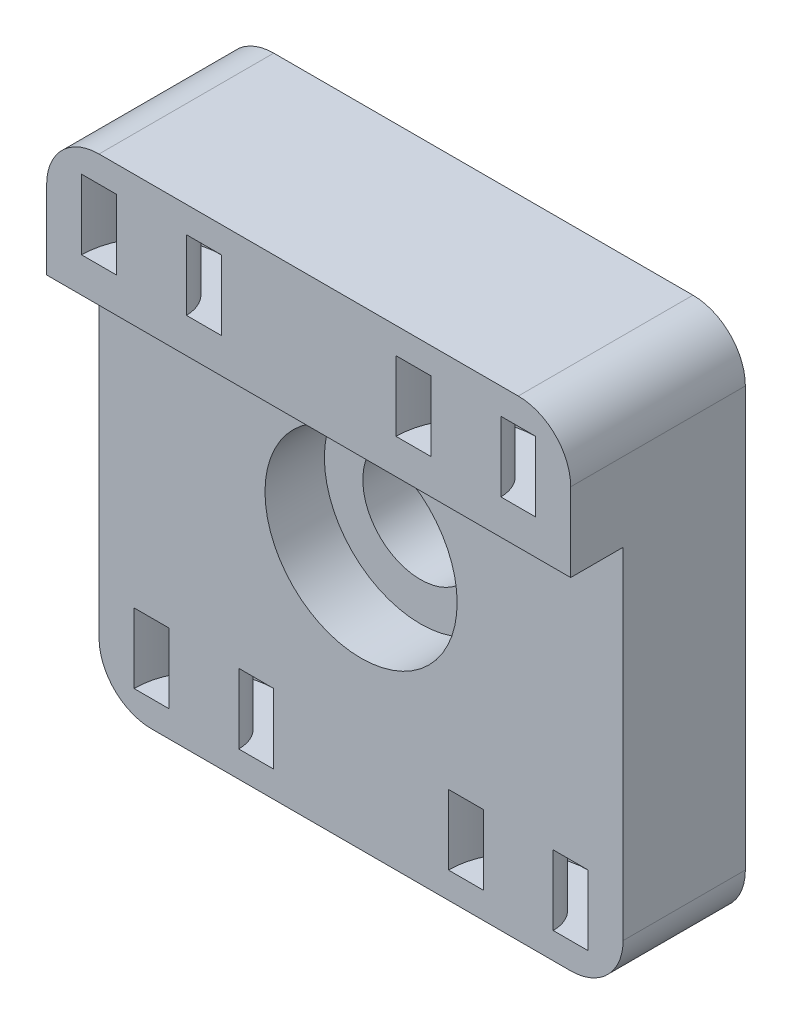
ISO-10303-21;
HEADER;
FILE_DESCRIPTION(('STEP AP214'),'2;1');
FILE_NAME('part.step','',(''),(''),'','','');
FILE_SCHEMA(('AUTOMOTIVE_DESIGN { 1 0 10303 214 1 1 1 1 }'));
ENDSEC;
DATA;
#1=APPLICATION_CONTEXT('core data for automotive mechanical design processes');
#2=APPLICATION_PROTOCOL_DEFINITION('international standard','automotive_design',2000,#1);
#3=PRODUCT_CONTEXT('',#1,'mechanical');
#4=PRODUCT('Part','Part','',(#3));
#5=PRODUCT_RELATED_PRODUCT_CATEGORY('part','',(#4));
#6=PRODUCT_DEFINITION_FORMATION('','',#4);
#7=PRODUCT_DEFINITION_CONTEXT('part definition',#1,'design');
#8=PRODUCT_DEFINITION('design','',#6,#7);
#9=PRODUCT_DEFINITION_SHAPE('','',#8);
#10=(LENGTH_UNIT() NAMED_UNIT(*) SI_UNIT(.MILLI.,.METRE.));
#11=(NAMED_UNIT(*) PLANE_ANGLE_UNIT() SI_UNIT($,.RADIAN.));
#12=(NAMED_UNIT(*) SI_UNIT($,.STERADIAN.) SOLID_ANGLE_UNIT());
#13=UNCERTAINTY_MEASURE_WITH_UNIT(LENGTH_MEASURE(1.E-05),#10,'distance_accuracy_value','');
#14=(GEOMETRIC_REPRESENTATION_CONTEXT(3) GLOBAL_UNCERTAINTY_ASSIGNED_CONTEXT((#13)) GLOBAL_UNIT_ASSIGNED_CONTEXT((#10,
#11,#12)) REPRESENTATION_CONTEXT('',''));
#15=CARTESIAN_POINT('',(0.,0.,0.));
#16=DIRECTION('',(0.,0.,1.));
#17=DIRECTION('',(1.,0.,0.));
#18=AXIS2_PLACEMENT_3D('',#15,#16,#17);
#19=CARTESIAN_POINT('',(0.,0.,10.));
#20=DIRECTION('',(0.,0.,1.));
#21=DIRECTION('',(1.,0.,0.));
#22=AXIS2_PLACEMENT_3D('',#19,#20,#21);
#23=PLANE('',#22);
#24=DIRECTION('',(0.,1.,0.));
#25=VECTOR('',#24,1.);
#26=CARTESIAN_POINT('',(-5.,9.5,10.));
#27=LINE('',#26,#25);
#28=CARTESIAN_POINT('',(-5.,9.5,10.));
#29=VERTEX_POINT('',#28);
#30=CARTESIAN_POINT('',(-5.,13.5,10.));
#31=VERTEX_POINT('',#30);
#32=EDGE_CURVE('E419',#29,#31,#27,.T.);
#33=ORIENTED_EDGE('',*,*,#32,.F.);
#34=DIRECTION('',(-1.,0.,0.));
#35=VECTOR('',#34,1.);
#36=CARTESIAN_POINT('',(0.,9.5,10.));
#37=LINE('',#36,#35);
#38=CARTESIAN_POINT('',(-7.,9.5,10.));
#39=VERTEX_POINT('',#38);
#40=EDGE_CURVE('E411',#29,#39,#37,.T.);
#41=ORIENTED_EDGE('',*,*,#40,.T.);
#42=DIRECTION('',(0.,1.,0.));
#43=VECTOR('',#42,1.);
#44=CARTESIAN_POINT('',(-7.,9.5,10.));
#45=LINE('',#44,#43);
#46=CARTESIAN_POINT('',(-7.,13.5,10.));
#47=VERTEX_POINT('',#46);
#48=EDGE_CURVE('E399',#39,#47,#45,.T.);
#49=ORIENTED_EDGE('',*,*,#48,.T.);
#50=DIRECTION('',(-1.,0.,0.));
#51=VECTOR('',#50,1.);
#52=CARTESIAN_POINT('',(0.,13.5,10.));
#53=LINE('',#52,#51);
#54=EDGE_CURVE('E415',#31,#47,#53,.T.);
#55=ORIENTED_EDGE('',*,*,#54,.F.);
#56=EDGE_LOOP('',(#33,#41,#49,#55));
#57=FACE_BOUND('',#56,.T.);
#58=DIRECTION('',(0.,1.,0.));
#59=VECTOR('',#58,1.);
#60=CARTESIAN_POINT('',(-13.,9.5,10.));
#61=LINE('',#60,#59);
#62=CARTESIAN_POINT('',(-13.,13.5,10.));
#63=VERTEX_POINT('',#62);
#64=CARTESIAN_POINT('',(-13.,9.5,10.));
#65=VERTEX_POINT('',#64);
#66=EDGE_CURVE('E408',#63,#65,#61,.F.);
#67=ORIENTED_EDGE('',*,*,#66,.F.);
#68=CARTESIAN_POINT('',(-11.,13.5,10.));
#69=VERTEX_POINT('',#68);
#70=EDGE_CURVE('E409',#69,#63,#53,.T.);
#71=ORIENTED_EDGE('',*,*,#70,.F.);
#72=DIRECTION('',(0.,1.,0.));
#73=VECTOR('',#72,1.);
#74=CARTESIAN_POINT('',(-11.,9.5,10.));
#75=LINE('',#74,#73);
#76=CARTESIAN_POINT('',(-11.,9.5,10.));
#77=VERTEX_POINT('',#76);
#78=EDGE_CURVE('E262',#69,#77,#75,.F.);
#79=ORIENTED_EDGE('',*,*,#78,.T.);
#80=EDGE_CURVE('E403',#77,#65,#37,.T.);
#81=ORIENTED_EDGE('',*,*,#80,.T.);
#82=EDGE_LOOP('',(#67,#71,#79,#81));
#83=FACE_BOUND('',#82,.T.);
#84=DIRECTION('',(0.,1.,0.));
#85=VECTOR('',#84,1.);
#86=CARTESIAN_POINT('',(15.,15.,10.));
#87=LINE('',#86,#85);
#88=CARTESIAN_POINT('',(15.,7.5,10.));
#89=VERTEX_POINT('',#88);
#90=CARTESIAN_POINT('',(15.,12.,10.));
#91=VERTEX_POINT('',#90);
#92=EDGE_CURVE('E340',#89,#91,#87,.T.);
#93=ORIENTED_EDGE('',*,*,#92,.T.);
#94=CARTESIAN_POINT('',(12.,12.,10.));
#95=DIRECTION('',(0.,0.,1.));
#96=DIRECTION('',(1.,0.,0.));
#97=AXIS2_PLACEMENT_3D('',#94,#95,#96);
#98=CIRCLE('',#97,3.);
#99=CARTESIAN_POINT('',(12.,15.,10.));
#100=VERTEX_POINT('',#99);
#101=EDGE_CURVE('E12',#91,#100,#98,.T.);
#102=ORIENTED_EDGE('',*,*,#101,.T.);
#103=DIRECTION('',(-1.,0.,0.));
#104=VECTOR('',#103,1.);
#105=CARTESIAN_POINT('',(-15.,15.,10.));
#106=LINE('',#105,#104);
#107=CARTESIAN_POINT('',(-12.,15.,10.));
#108=VERTEX_POINT('',#107);
#109=EDGE_CURVE('E333',#100,#108,#106,.T.);
#110=ORIENTED_EDGE('',*,*,#109,.T.);
#111=CARTESIAN_POINT('',(-12.,12.,10.));
#112=DIRECTION('',(0.,0.,1.));
#113=DIRECTION('',(1.,0.,0.));
#114=AXIS2_PLACEMENT_3D('',#111,#112,#113);
#115=CIRCLE('',#114,3.);
#116=CARTESIAN_POINT('',(-15.,12.,10.));
#117=VERTEX_POINT('',#116);
#118=EDGE_CURVE('E71',#108,#117,#115,.T.);
#119=ORIENTED_EDGE('',*,*,#118,.T.);
#120=DIRECTION('',(0.,-1.,0.));
#121=VECTOR('',#120,1.);
#122=CARTESIAN_POINT('',(-15.,15.,10.));
#123=LINE('',#122,#121);
#124=CARTESIAN_POINT('',(-15.,7.5,10.));
#125=VERTEX_POINT('',#124);
#126=EDGE_CURVE('E337',#117,#125,#123,.T.);
#127=ORIENTED_EDGE('',*,*,#126,.T.);
#128=DIRECTION('',(1.,0.,0.));
#129=VECTOR('',#128,1.);
#130=CARTESIAN_POINT('',(-15.,7.5,10.));
#131=LINE('',#130,#129);
#132=EDGE_CURVE('E342',#125,#89,#131,.T.);
#133=ORIENTED_EDGE('',*,*,#132,.T.);
#134=EDGE_LOOP('',(#93,#102,#110,#119,#127,#133));
#135=FACE_BOUND('',#134,.T.);
#136=DIRECTION('',(1.,0.,0.));
#137=VECTOR('',#136,1.);
#138=CARTESIAN_POINT('',(0.,9.5,10.));
#139=LINE('',#138,#137);
#140=CARTESIAN_POINT('',(5.00000000000001,9.5,10.));
#141=VERTEX_POINT('',#140);
#142=CARTESIAN_POINT('',(7.00000000000001,9.5,10.));
#143=VERTEX_POINT('',#142);
#144=EDGE_CURVE('E255',#141,#143,#139,.T.);
#145=ORIENTED_EDGE('',*,*,#144,.F.);
#146=DIRECTION('',(0.,1.,0.));
#147=VECTOR('',#146,1.);
#148=CARTESIAN_POINT('',(5.00000000000001,9.5,10.));
#149=LINE('',#148,#147);
#150=CARTESIAN_POINT('',(5.00000000000001,13.5,10.));
#151=VERTEX_POINT('',#150);
#152=EDGE_CURVE('E247',#141,#151,#149,.T.);
#153=ORIENTED_EDGE('',*,*,#152,.T.);
#154=DIRECTION('',(1.,0.,0.));
#155=VECTOR('',#154,1.);
#156=CARTESIAN_POINT('',(0.,13.5,10.));
#157=LINE('',#156,#155);
#158=CARTESIAN_POINT('',(7.00000000000001,13.5,10.));
#159=VERTEX_POINT('',#158);
#160=EDGE_CURVE('E265',#151,#159,#157,.T.);
#161=ORIENTED_EDGE('',*,*,#160,.T.);
#162=DIRECTION('',(0.,1.,0.));
#163=VECTOR('',#162,1.);
#164=CARTESIAN_POINT('',(7.00000000000001,9.5,10.));
#165=LINE('',#164,#163);
#166=EDGE_CURVE('E269',#143,#159,#165,.T.);
#167=ORIENTED_EDGE('',*,*,#166,.F.);
#168=EDGE_LOOP('',(#145,#153,#161,#167));
#169=FACE_BOUND('',#168,.T.);
#170=CARTESIAN_POINT('',(11.,13.5,10.));
#171=VERTEX_POINT('',#170);
#172=CARTESIAN_POINT('',(13.,13.5,10.));
#173=VERTEX_POINT('',#172);
#174=EDGE_CURVE('E246',#171,#173,#157,.T.);
#175=ORIENTED_EDGE('',*,*,#174,.T.);
#176=DIRECTION('',(0.,1.,0.));
#177=VECTOR('',#176,1.);
#178=CARTESIAN_POINT('',(13.,9.5,10.));
#179=LINE('',#178,#177);
#180=CARTESIAN_POINT('',(13.,9.5,10.));
#181=VERTEX_POINT('',#180);
#182=EDGE_CURVE('E260',#173,#181,#179,.F.);
#183=ORIENTED_EDGE('',*,*,#182,.T.);
#184=CARTESIAN_POINT('',(11.,9.5,10.));
#185=VERTEX_POINT('',#184);
#186=EDGE_CURVE('E252',#185,#181,#139,.T.);
#187=ORIENTED_EDGE('',*,*,#186,.F.);
#188=DIRECTION('',(0.,1.,0.));
#189=VECTOR('',#188,1.);
#190=CARTESIAN_POINT('',(11.,9.5,10.));
#191=LINE('',#190,#189);
#192=EDGE_CURVE('E235',#171,#185,#191,.F.);
#193=ORIENTED_EDGE('',*,*,#192,.F.);
#194=EDGE_LOOP('',(#175,#183,#187,#193));
#195=FACE_BOUND('',#194,.T.);
#196=ADVANCED_FACE('F63',(#57,#83,#135,#169,#195),#23,.T.);
#197=CARTESIAN_POINT('',(0.,0.,7.));
#198=DIRECTION('',(0.,0.,1.));
#199=DIRECTION('',(1.,0.,0.));
#200=AXIS2_PLACEMENT_3D('',#197,#198,#199);
#201=PLANE('',#200);
#202=DIRECTION('',(0.,-1.,0.));
#203=VECTOR('',#202,1.);
#204=CARTESIAN_POINT('',(-13.,-9.5,7.));
#205=LINE('',#204,#203);
#206=CARTESIAN_POINT('',(-13.,-9.5,7.));
#207=VERTEX_POINT('',#206);
#208=CARTESIAN_POINT('',(-13.,-13.5,7.));
#209=VERTEX_POINT('',#208);
#210=EDGE_CURVE('E271',#207,#209,#205,.T.);
#211=ORIENTED_EDGE('',*,*,#210,.F.);
#212=DIRECTION('',(1.,0.,0.));
#213=VECTOR('',#212,1.);
#214=CARTESIAN_POINT('',(0.,-9.5,7.));
#215=LINE('',#214,#213);
#216=CARTESIAN_POINT('',(-11.,-9.5,7.));
#217=VERTEX_POINT('',#216);
#218=EDGE_CURVE('E275',#207,#217,#215,.T.);
#219=ORIENTED_EDGE('',*,*,#218,.T.);
#220=DIRECTION('',(0.,-1.,0.));
#221=VECTOR('',#220,1.);
#222=CARTESIAN_POINT('',(-11.,-9.5,7.));
#223=LINE('',#222,#221);
#224=CARTESIAN_POINT('',(-11.,-13.5,7.));
#225=VERTEX_POINT('',#224);
#226=EDGE_CURVE('E276',#217,#225,#223,.T.);
#227=ORIENTED_EDGE('',*,*,#226,.T.);
#228=DIRECTION('',(1.,0.,0.));
#229=VECTOR('',#228,1.);
#230=CARTESIAN_POINT('',(0.,-13.5,7.));
#231=LINE('',#230,#229);
#232=EDGE_CURVE('E279',#209,#225,#231,.T.);
#233=ORIENTED_EDGE('',*,*,#232,.F.);
#234=EDGE_LOOP('',(#211,#219,#227,#233));
#235=FACE_BOUND('',#234,.T.);
#236=DIRECTION('',(0.,-1.,0.));
#237=VECTOR('',#236,1.);
#238=CARTESIAN_POINT('',(-5.,-9.5,7.));
#239=LINE('',#238,#237);
#240=CARTESIAN_POINT('',(-5.,-13.5,7.));
#241=VERTEX_POINT('',#240);
#242=CARTESIAN_POINT('',(-5.,-9.5,7.));
#243=VERTEX_POINT('',#242);
#244=EDGE_CURVE('E280',#241,#243,#239,.F.);
#245=ORIENTED_EDGE('',*,*,#244,.F.);
#246=CARTESIAN_POINT('',(-7.,-13.5,7.));
#247=VERTEX_POINT('',#246);
#248=EDGE_CURVE('E285',#247,#241,#231,.T.);
#249=ORIENTED_EDGE('',*,*,#248,.F.);
#250=DIRECTION('',(0.,-1.,0.));
#251=VECTOR('',#250,1.);
#252=CARTESIAN_POINT('',(-7.,-9.5,7.));
#253=LINE('',#252,#251);
#254=CARTESIAN_POINT('',(-7.,-9.5,7.));
#255=VERTEX_POINT('',#254);
#256=EDGE_CURVE('E287',#247,#255,#253,.F.);
#257=ORIENTED_EDGE('',*,*,#256,.T.);
#258=EDGE_CURVE('E282',#255,#243,#215,.T.);
#259=ORIENTED_EDGE('',*,*,#258,.T.);
#260=EDGE_LOOP('',(#245,#249,#257,#259));
#261=FACE_BOUND('',#260,.T.);
#262=CARTESIAN_POINT('',(0.,0.,7.));
#263=DIRECTION('',(0.,0.,1.));
#264=DIRECTION('',(1.,0.,0.));
#265=AXIS2_PLACEMENT_3D('',#262,#263,#264);
#266=CIRCLE('',#265,5.49999999999999);
#267=CARTESIAN_POINT('',(5.49999999999999,0.,7.));
#268=VERTEX_POINT('',#267);
#269=EDGE_CURVE('E353',#268,#268,#266,.T.);
#270=ORIENTED_EDGE('',*,*,#269,.F.);
#271=EDGE_LOOP('',(#270));
#272=FACE_BOUND('',#271,.T.);
#273=DIRECTION('',(0.,-1.,0.));
#274=VECTOR('',#273,1.);
#275=CARTESIAN_POINT('',(-15.,15.,7.));
#276=LINE('',#275,#274);
#277=CARTESIAN_POINT('',(-15.,7.5,7.));
#278=VERTEX_POINT('',#277);
#279=CARTESIAN_POINT('',(-15.,-12.,7.));
#280=VERTEX_POINT('',#279);
#281=EDGE_CURVE('E324',#278,#280,#276,.T.);
#282=ORIENTED_EDGE('',*,*,#281,.T.);
#283=CARTESIAN_POINT('',(-12.,-12.,7.));
#284=DIRECTION('',(0.,0.,1.));
#285=DIRECTION('',(1.,0.,0.));
#286=AXIS2_PLACEMENT_3D('',#283,#284,#285);
#287=CIRCLE('',#286,3.);
#288=CARTESIAN_POINT('',(-12.,-15.,7.));
#289=VERTEX_POINT('',#288);
#290=EDGE_CURVE('E441',#280,#289,#287,.T.);
#291=ORIENTED_EDGE('',*,*,#290,.T.);
#292=DIRECTION('',(1.,0.,0.));
#293=VECTOR('',#292,1.);
#294=CARTESIAN_POINT('',(-15.,-15.,7.));
#295=LINE('',#294,#293);
#296=CARTESIAN_POINT('',(12.,-15.,7.));
#297=VERTEX_POINT('',#296);
#298=EDGE_CURVE('E308',#289,#297,#295,.T.);
#299=ORIENTED_EDGE('',*,*,#298,.T.);
#300=CARTESIAN_POINT('',(12.,-12.,7.));
#301=DIRECTION('',(0.,0.,1.));
#302=DIRECTION('',(1.,0.,0.));
#303=AXIS2_PLACEMENT_3D('',#300,#301,#302);
#304=CIRCLE('',#303,3.);
#305=CARTESIAN_POINT('',(15.,-12.,7.));
#306=VERTEX_POINT('',#305);
#307=EDGE_CURVE('E439',#297,#306,#304,.T.);
#308=ORIENTED_EDGE('',*,*,#307,.T.);
#309=DIRECTION('',(0.,1.,0.));
#310=VECTOR('',#309,1.);
#311=CARTESIAN_POINT('',(15.,15.,7.));
#312=LINE('',#311,#310);
#313=CARTESIAN_POINT('',(15.,7.5,7.));
#314=VERTEX_POINT('',#313);
#315=EDGE_CURVE('E312',#306,#314,#312,.T.);
#316=ORIENTED_EDGE('',*,*,#315,.T.);
#317=DIRECTION('',(1.,0.,0.));
#318=VECTOR('',#317,1.);
#319=CARTESIAN_POINT('',(-15.,7.5,7.));
#320=LINE('',#319,#318);
#321=EDGE_CURVE('E334',#278,#314,#320,.T.);
#322=ORIENTED_EDGE('',*,*,#321,.F.);
#323=EDGE_LOOP('',(#282,#291,#299,#308,#316,#322));
#324=FACE_BOUND('',#323,.T.);
#325=DIRECTION('',(-1.,0.,0.));
#326=VECTOR('',#325,1.);
#327=CARTESIAN_POINT('',(0.,-9.5,7.));
#328=LINE('',#327,#326);
#329=CARTESIAN_POINT('',(13.,-9.5,7.));
#330=VERTEX_POINT('',#329);
#331=CARTESIAN_POINT('',(11.,-9.5,7.));
#332=VERTEX_POINT('',#331);
#333=EDGE_CURVE('E300',#330,#332,#328,.T.);
#334=ORIENTED_EDGE('',*,*,#333,.F.);
#335=DIRECTION('',(0.,-1.,0.));
#336=VECTOR('',#335,1.);
#337=CARTESIAN_POINT('',(13.,-9.5,7.));
#338=LINE('',#337,#336);
#339=CARTESIAN_POINT('',(13.,-13.5,7.));
#340=VERTEX_POINT('',#339);
#341=EDGE_CURVE('E297',#330,#340,#338,.T.);
#342=ORIENTED_EDGE('',*,*,#341,.T.);
#343=DIRECTION('',(-1.,0.,0.));
#344=VECTOR('',#343,1.);
#345=CARTESIAN_POINT('',(0.,-13.5,7.));
#346=LINE('',#345,#344);
#347=CARTESIAN_POINT('',(11.,-13.5,7.));
#348=VERTEX_POINT('',#347);
#349=EDGE_CURVE('E303',#340,#348,#346,.T.);
#350=ORIENTED_EDGE('',*,*,#349,.T.);
#351=DIRECTION('',(0.,-1.,0.));
#352=VECTOR('',#351,1.);
#353=CARTESIAN_POINT('',(11.,-9.5,7.));
#354=LINE('',#353,#352);
#355=EDGE_CURVE('E306',#332,#348,#354,.T.);
#356=ORIENTED_EDGE('',*,*,#355,.F.);
#357=EDGE_LOOP('',(#334,#342,#350,#356));
#358=FACE_BOUND('',#357,.T.);
#359=CARTESIAN_POINT('',(7.,-13.5,7.));
#360=VERTEX_POINT('',#359);
#361=CARTESIAN_POINT('',(5.,-13.5,7.));
#362=VERTEX_POINT('',#361);
#363=EDGE_CURVE('E296',#360,#362,#346,.T.);
#364=ORIENTED_EDGE('',*,*,#363,.T.);
#365=DIRECTION('',(0.,-1.,0.));
#366=VECTOR('',#365,1.);
#367=CARTESIAN_POINT('',(5.,-9.5,7.));
#368=LINE('',#367,#366);
#369=CARTESIAN_POINT('',(5.,-9.5,7.));
#370=VERTEX_POINT('',#369);
#371=EDGE_CURVE('E290',#362,#370,#368,.F.);
#372=ORIENTED_EDGE('',*,*,#371,.T.);
#373=CARTESIAN_POINT('',(7.,-9.5,7.));
#374=VERTEX_POINT('',#373);
#375=EDGE_CURVE('E293',#374,#370,#328,.T.);
#376=ORIENTED_EDGE('',*,*,#375,.F.);
#377=DIRECTION('',(0.,-1.,0.));
#378=VECTOR('',#377,1.);
#379=CARTESIAN_POINT('',(7.,-9.5,7.));
#380=LINE('',#379,#378);
#381=EDGE_CURVE('E294',#360,#374,#380,.F.);
#382=ORIENTED_EDGE('',*,*,#381,.F.);
#383=EDGE_LOOP('',(#364,#372,#376,#382));
#384=FACE_BOUND('',#383,.T.);
#385=ADVANCED_FACE('F489',(#235,#261,#272,#324,#358,#384),#201,.T.);
#386=CARTESIAN_POINT('',(15.,15.,7.));
#387=DIRECTION('',(-1.,0.,0.));
#388=DIRECTION('',(0.,-1.,0.));
#389=AXIS2_PLACEMENT_3D('',#386,#387,#388);
#390=PLANE('',#389);
#391=ORIENTED_EDGE('',*,*,#315,.F.);
#392=DIRECTION('',(0.,0.,-1.));
#393=VECTOR('',#392,1.);
#394=CARTESIAN_POINT('',(15.,-12.,7.));
#395=LINE('',#394,#393);
#396=CARTESIAN_POINT('',(15.,-12.,0.));
#397=VERTEX_POINT('',#396);
#398=EDGE_CURVE('E445',#306,#397,#395,.T.);
#399=ORIENTED_EDGE('',*,*,#398,.T.);
#400=DIRECTION('',(0.,1.,0.));
#401=VECTOR('',#400,1.);
#402=CARTESIAN_POINT('',(15.,15.,0.));
#403=LINE('',#402,#401);
#404=CARTESIAN_POINT('',(15.,12.,0.));
#405=VERTEX_POINT('',#404);
#406=EDGE_CURVE('E318',#397,#405,#403,.T.);
#407=ORIENTED_EDGE('',*,*,#406,.T.);
#408=DIRECTION('',(0.,0.,-1.));
#409=VECTOR('',#408,1.);
#410=CARTESIAN_POINT('',(15.,12.,7.));
#411=LINE('',#410,#409);
#412=EDGE_CURVE('E443',#405,#91,#411,.F.);
#413=ORIENTED_EDGE('',*,*,#412,.T.);
#414=ORIENTED_EDGE('',*,*,#92,.F.);
#415=DIRECTION('',(0.,0.,-1.));
#416=VECTOR('',#415,1.);
#417=CARTESIAN_POINT('',(15.,7.5,10.));
#418=LINE('',#417,#416);
#419=EDGE_CURVE('E330',#89,#314,#418,.T.);
#420=ORIENTED_EDGE('',*,*,#419,.T.);
#421=EDGE_LOOP('',(#391,#399,#407,#413,#414,#420));
#422=FACE_BOUND('',#421,.T.);
#423=ADVANCED_FACE('F473',(#422),#390,.F.);
#424=CARTESIAN_POINT('',(-15.,15.,7.));
#425=DIRECTION('',(0.,-1.,0.));
#426=DIRECTION('',(0.,0.,-1.));
#427=AXIS2_PLACEMENT_3D('',#424,#425,#426);
#428=PLANE('',#427);
#429=ORIENTED_EDGE('',*,*,#109,.F.);
#430=DIRECTION('',(0.,0.,-1.));
#431=VECTOR('',#430,1.);
#432=CARTESIAN_POINT('',(12.,15.,7.));
#433=LINE('',#432,#431);
#434=CARTESIAN_POINT('',(12.,15.,0.));
#435=VERTEX_POINT('',#434);
#436=EDGE_CURVE('E449',#100,#435,#433,.T.);
#437=ORIENTED_EDGE('',*,*,#436,.T.);
#438=DIRECTION('',(-1.,0.,0.));
#439=VECTOR('',#438,1.);
#440=CARTESIAN_POINT('',(-15.,15.,0.));
#441=LINE('',#440,#439);
#442=CARTESIAN_POINT('',(-12.,15.,0.));
#443=VERTEX_POINT('',#442);
#444=EDGE_CURVE('E316',#435,#443,#441,.T.);
#445=ORIENTED_EDGE('',*,*,#444,.T.);
#446=DIRECTION('',(0.,0.,-1.));
#447=VECTOR('',#446,1.);
#448=CARTESIAN_POINT('',(-12.,15.,7.));
#449=LINE('',#448,#447);
#450=EDGE_CURVE('E78',#443,#108,#449,.F.);
#451=ORIENTED_EDGE('',*,*,#450,.T.);
#452=EDGE_LOOP('',(#429,#437,#445,#451));
#453=FACE_BOUND('',#452,.T.);
#454=ADVANCED_FACE('F465',(#453),#428,.F.);
#455=CARTESIAN_POINT('',(-15.,15.,7.));
#456=DIRECTION('',(1.,0.,0.));
#457=DIRECTION('',(0.,1.,0.));
#458=AXIS2_PLACEMENT_3D('',#455,#456,#457);
#459=PLANE('',#458);
#460=DIRECTION('',(0.,-1.,0.));
#461=VECTOR('',#460,1.);
#462=CARTESIAN_POINT('',(-15.,15.,0.));
#463=LINE('',#462,#461);
#464=CARTESIAN_POINT('',(-15.,12.,0.));
#465=VERTEX_POINT('',#464);
#466=CARTESIAN_POINT('',(-15.,-12.,0.));
#467=VERTEX_POINT('',#466);
#468=EDGE_CURVE('E313',#465,#467,#463,.T.);
#469=ORIENTED_EDGE('',*,*,#468,.T.);
#470=DIRECTION('',(0.,0.,-1.));
#471=VECTOR('',#470,1.);
#472=CARTESIAN_POINT('',(-15.,-12.,7.));
#473=LINE('',#472,#471);
#474=EDGE_CURVE('E437',#467,#280,#473,.F.);
#475=ORIENTED_EDGE('',*,*,#474,.T.);
#476=ORIENTED_EDGE('',*,*,#281,.F.);
#477=DIRECTION('',(0.,0.,-1.));
#478=VECTOR('',#477,1.);
#479=CARTESIAN_POINT('',(-15.,7.5,10.));
#480=LINE('',#479,#478);
#481=EDGE_CURVE('E321',#125,#278,#480,.T.);
#482=ORIENTED_EDGE('',*,*,#481,.F.);
#483=ORIENTED_EDGE('',*,*,#126,.F.);
#484=DIRECTION('',(0.,0.,-1.));
#485=VECTOR('',#484,1.);
#486=CARTESIAN_POINT('',(-15.,12.,7.));
#487=LINE('',#486,#485);
#488=EDGE_CURVE('E434',#117,#465,#487,.T.);
#489=ORIENTED_EDGE('',*,*,#488,.T.);
#490=EDGE_LOOP('',(#469,#475,#476,#482,#483,#489));
#491=FACE_BOUND('',#490,.T.);
#492=ADVANCED_FACE('F458',(#491),#459,.F.);
#493=CARTESIAN_POINT('',(-15.,-15.,7.));
#494=DIRECTION('',(0.,1.,0.));
#495=DIRECTION('',(0.,0.,1.));
#496=AXIS2_PLACEMENT_3D('',#493,#494,#495);
#497=PLANE('',#496);
#498=ORIENTED_EDGE('',*,*,#298,.F.);
#499=DIRECTION('',(0.,0.,-1.));
#500=VECTOR('',#499,1.);
#501=CARTESIAN_POINT('',(-12.,-15.,7.));
#502=LINE('',#501,#500);
#503=CARTESIAN_POINT('',(-12.,-15.,0.));
#504=VERTEX_POINT('',#503);
#505=EDGE_CURVE('E423',#289,#504,#502,.T.);
#506=ORIENTED_EDGE('',*,*,#505,.T.);
#507=DIRECTION('',(1.,0.,0.));
#508=VECTOR('',#507,1.);
#509=CARTESIAN_POINT('',(-15.,-15.,0.));
#510=LINE('',#509,#508);
#511=CARTESIAN_POINT('',(12.,-15.,0.));
#512=VERTEX_POINT('',#511);
#513=EDGE_CURVE('E309',#504,#512,#510,.T.);
#514=ORIENTED_EDGE('',*,*,#513,.T.);
#515=DIRECTION('',(0.,0.,-1.));
#516=VECTOR('',#515,1.);
#517=CARTESIAN_POINT('',(12.,-15.,7.));
#518=LINE('',#517,#516);
#519=EDGE_CURVE('E421',#512,#297,#518,.F.);
#520=ORIENTED_EDGE('',*,*,#519,.T.);
#521=EDGE_LOOP('',(#498,#506,#514,#520));
#522=FACE_BOUND('',#521,.T.);
#523=ADVANCED_FACE('F482',(#522),#497,.F.);
#524=CARTESIAN_POINT('',(0.,0.,0.));
#525=DIRECTION('',(0.,0.,1.));
#526=DIRECTION('',(1.,0.,0.));
#527=AXIS2_PLACEMENT_3D('',#524,#525,#526);
#528=PLANE('',#527);
#529=CARTESIAN_POINT('',(0.,0.,0.));
#530=DIRECTION('',(0.,0.,1.));
#531=DIRECTION('',(1.,0.,0.));
#532=AXIS2_PLACEMENT_3D('',#529,#530,#531);
#533=CIRCLE('',#532,3.3);
#534=CARTESIAN_POINT('',(3.3,0.,0.));
#535=VERTEX_POINT('',#534);
#536=EDGE_CURVE('E338',#535,#535,#533,.T.);
#537=ORIENTED_EDGE('',*,*,#536,.T.);
#538=EDGE_LOOP('',(#537));
#539=FACE_BOUND('',#538,.T.);
#540=ORIENTED_EDGE('',*,*,#513,.F.);
#541=CARTESIAN_POINT('',(-12.,-12.,0.));
#542=DIRECTION('',(0.,0.,1.));
#543=DIRECTION('',(1.,0.,0.));
#544=AXIS2_PLACEMENT_3D('',#541,#542,#543);
#545=CIRCLE('',#544,3.);
#546=EDGE_CURVE('E432',#504,#467,#545,.F.);
#547=ORIENTED_EDGE('',*,*,#546,.T.);
#548=ORIENTED_EDGE('',*,*,#468,.F.);
#549=CARTESIAN_POINT('',(-12.,12.,0.));
#550=DIRECTION('',(0.,0.,1.));
#551=DIRECTION('',(1.,0.,0.));
#552=AXIS2_PLACEMENT_3D('',#549,#550,#551);
#553=CIRCLE('',#552,3.);
#554=EDGE_CURVE('E426',#465,#443,#553,.F.);
#555=ORIENTED_EDGE('',*,*,#554,.T.);
#556=ORIENTED_EDGE('',*,*,#444,.F.);
#557=CARTESIAN_POINT('',(12.,12.,0.));
#558=DIRECTION('',(0.,0.,1.));
#559=DIRECTION('',(1.,0.,0.));
#560=AXIS2_PLACEMENT_3D('',#557,#558,#559);
#561=CIRCLE('',#560,3.);
#562=EDGE_CURVE('E428',#435,#405,#561,.F.);
#563=ORIENTED_EDGE('',*,*,#562,.T.);
#564=ORIENTED_EDGE('',*,*,#406,.F.);
#565=CARTESIAN_POINT('',(12.,-12.,0.));
#566=DIRECTION('',(0.,0.,1.));
#567=DIRECTION('',(1.,0.,0.));
#568=AXIS2_PLACEMENT_3D('',#565,#566,#567);
#569=CIRCLE('',#568,3.);
#570=EDGE_CURVE('E430',#397,#512,#569,.F.);
#571=ORIENTED_EDGE('',*,*,#570,.T.);
#572=EDGE_LOOP('',(#540,#547,#548,#555,#556,#563,#564,#571));
#573=FACE_BOUND('',#572,.T.);
#574=ADVANCED_FACE('F464',(#539,#573),#528,.F.);
#575=CARTESIAN_POINT('',(-15.,7.5,10.));
#576=DIRECTION('',(0.,1.,0.));
#577=DIRECTION('',(0.,0.,1.));
#578=AXIS2_PLACEMENT_3D('',#575,#576,#577);
#579=PLANE('',#578);
#580=ORIENTED_EDGE('',*,*,#321,.T.);
#581=ORIENTED_EDGE('',*,*,#419,.F.);
#582=ORIENTED_EDGE('',*,*,#132,.F.);
#583=ORIENTED_EDGE('',*,*,#481,.T.);
#584=EDGE_LOOP('',(#580,#581,#582,#583));
#585=FACE_BOUND('',#584,.T.);
#586=ADVANCED_FACE('F493',(#585),#579,.F.);
#587=CARTESIAN_POINT('',(0.,0.,7.));
#588=DIRECTION('',(0.,0.,1.));
#589=DIRECTION('',(1.,0.,0.));
#590=AXIS2_PLACEMENT_3D('',#587,#588,#589);
#591=CYLINDRICAL_SURFACE('',#590,3.3);
#592=ORIENTED_EDGE('',*,*,#536,.F.);
#593=EDGE_LOOP('',(#592));
#594=FACE_BOUND('',#593,.T.);
#595=CARTESIAN_POINT('',(0.,0.,3.6));
#596=DIRECTION('',(0.,0.,1.));
#597=DIRECTION('',(1.,0.,0.));
#598=AXIS2_PLACEMENT_3D('',#595,#596,#597);
#599=CIRCLE('',#598,3.3);
#600=CARTESIAN_POINT('',(3.3,0.,3.6));
#601=VERTEX_POINT('',#600);
#602=EDGE_CURVE('E347',#601,#601,#599,.T.);
#603=ORIENTED_EDGE('',*,*,#602,.T.);
#604=EDGE_LOOP('',(#603));
#605=FACE_BOUND('',#604,.T.);
#606=ADVANCED_FACE('F495',(#594,#605),#591,.F.);
#607=CARTESIAN_POINT('',(3.3,0.,3.6));
#608=DIRECTION('',(0.,0.,-1.));
#609=DIRECTION('',(-1.,0.,0.));
#610=AXIS2_PLACEMENT_3D('',#607,#608,#609);
#611=PLANE('',#610);
#612=ORIENTED_EDGE('',*,*,#602,.F.);
#613=EDGE_LOOP('',(#612));
#614=FACE_BOUND('',#613,.T.);
#615=CARTESIAN_POINT('',(0.,0.,3.6));
#616=DIRECTION('',(0.,0.,1.));
#617=DIRECTION('',(1.,0.,0.));
#618=AXIS2_PLACEMENT_3D('',#615,#616,#617);
#619=CIRCLE('',#618,5.5);
#620=CARTESIAN_POINT('',(5.5,0.,3.6));
#621=VERTEX_POINT('',#620);
#622=EDGE_CURVE('E350',#621,#621,#619,.T.);
#623=ORIENTED_EDGE('',*,*,#622,.T.);
#624=EDGE_LOOP('',(#623));
#625=FACE_BOUND('',#624,.T.);
#626=ADVANCED_FACE('F501',(#614,#625),#611,.F.);
#627=CARTESIAN_POINT('',(0.,0.,7.));
#628=DIRECTION('',(0.,0.,1.));
#629=DIRECTION('',(1.,0.,0.));
#630=AXIS2_PLACEMENT_3D('',#627,#628,#629);
#631=CYLINDRICAL_SURFACE('',#630,5.5);
#632=ORIENTED_EDGE('',*,*,#622,.F.);
#633=EDGE_LOOP('',(#632));
#634=FACE_BOUND('',#633,.T.);
#635=ORIENTED_EDGE('',*,*,#269,.T.);
#636=EDGE_LOOP('',(#635));
#637=FACE_BOUND('',#636,.T.);
#638=ADVANCED_FACE('F518',(#634,#637),#631,.F.);
#639=CARTESIAN_POINT('',(9.,-9.5,7.));
#640=DIRECTION('',(0.,1.,0.));
#641=DIRECTION('',(0.,0.,1.));
#642=AXIS2_PLACEMENT_3D('',#639,#640,#641);
#643=PLANE('',#642);
#644=ORIENTED_EDGE('',*,*,#333,.T.);
#645=CARTESIAN_POINT('',(9.,-9.5,7.));
#646=DIRECTION('',(0.,1.,0.));
#647=DIRECTION('',(0.,0.,1.));
#648=AXIS2_PLACEMENT_3D('',#645,#646,#647);
#649=CIRCLE('',#648,2.);
#650=EDGE_CURVE('E357',#332,#374,#649,.T.);
#651=ORIENTED_EDGE('',*,*,#650,.T.);
#652=ORIENTED_EDGE('',*,*,#375,.T.);
#653=CARTESIAN_POINT('',(9.,-9.5,7.));
#654=DIRECTION('',(0.,1.,0.));
#655=DIRECTION('',(0.,0.,1.));
#656=AXIS2_PLACEMENT_3D('',#653,#654,#655);
#657=CIRCLE('',#656,4.);
#658=EDGE_CURVE('E364',#330,#370,#657,.T.);
#659=ORIENTED_EDGE('',*,*,#658,.F.);
#660=EDGE_LOOP('',(#644,#651,#652,#659));
#661=FACE_BOUND('',#660,.T.);
#662=ADVANCED_FACE('F522',(#661),#643,.F.);
#663=CARTESIAN_POINT('',(9.,-13.5,7.));
#664=DIRECTION('',(0.,1.,0.));
#665=DIRECTION('',(0.,0.,1.));
#666=AXIS2_PLACEMENT_3D('',#663,#664,#665);
#667=PLANE('',#666);
#668=CARTESIAN_POINT('',(9.,-13.5,7.));
#669=DIRECTION('',(0.,1.,0.));
#670=DIRECTION('',(0.,0.,1.));
#671=AXIS2_PLACEMENT_3D('',#668,#669,#670);
#672=CIRCLE('',#671,4.);
#673=EDGE_CURVE('E361',#340,#362,#672,.T.);
#674=ORIENTED_EDGE('',*,*,#673,.T.);
#675=ORIENTED_EDGE('',*,*,#363,.F.);
#676=CARTESIAN_POINT('',(9.,-13.5,7.));
#677=DIRECTION('',(0.,1.,0.));
#678=DIRECTION('',(0.,0.,1.));
#679=AXIS2_PLACEMENT_3D('',#676,#677,#678);
#680=CIRCLE('',#679,2.);
#681=EDGE_CURVE('E360',#348,#360,#680,.T.);
#682=ORIENTED_EDGE('',*,*,#681,.F.);
#683=ORIENTED_EDGE('',*,*,#349,.F.);
#684=EDGE_LOOP('',(#674,#675,#682,#683));
#685=FACE_BOUND('',#684,.T.);
#686=ADVANCED_FACE('F532',(#685),#667,.T.);
#687=CARTESIAN_POINT('',(9.,-9.5,7.));
#688=DIRECTION('',(0.,-1.,0.));
#689=DIRECTION('',(0.,0.,-1.));
#690=AXIS2_PLACEMENT_3D('',#687,#688,#689);
#691=CYLINDRICAL_SURFACE('',#690,4.);
#692=ORIENTED_EDGE('',*,*,#673,.F.);
#693=ORIENTED_EDGE('',*,*,#341,.F.);
#694=ORIENTED_EDGE('',*,*,#658,.T.);
#695=ORIENTED_EDGE('',*,*,#371,.F.);
#696=EDGE_LOOP('',(#692,#693,#694,#695));
#697=FACE_BOUND('',#696,.T.);
#698=ADVANCED_FACE('F528',(#697),#691,.F.);
#699=CARTESIAN_POINT('',(9.,-9.5,7.));
#700=DIRECTION('',(0.,-1.,0.));
#701=DIRECTION('',(0.,0.,-1.));
#702=AXIS2_PLACEMENT_3D('',#699,#700,#701);
#703=CYLINDRICAL_SURFACE('',#702,2.);
#704=ORIENTED_EDGE('',*,*,#381,.T.);
#705=ORIENTED_EDGE('',*,*,#650,.F.);
#706=ORIENTED_EDGE('',*,*,#355,.T.);
#707=ORIENTED_EDGE('',*,*,#681,.T.);
#708=EDGE_LOOP('',(#704,#705,#706,#707));
#709=FACE_BOUND('',#708,.T.);
#710=ADVANCED_FACE('F524',(#709),#703,.T.);
#711=CARTESIAN_POINT('',(-9.,-9.5,7.));
#712=DIRECTION('',(0.,-1.,0.));
#713=DIRECTION('',(0.,0.,-1.));
#714=AXIS2_PLACEMENT_3D('',#711,#712,#713);
#715=CYLINDRICAL_SURFACE('',#714,4.);
#716=ORIENTED_EDGE('',*,*,#210,.T.);
#717=CARTESIAN_POINT('',(-9.,-13.5,7.));
#718=DIRECTION('',(0.,-1.,0.));
#719=DIRECTION('',(0.,0.,-1.));
#720=AXIS2_PLACEMENT_3D('',#717,#718,#719);
#721=CIRCLE('',#720,4.);
#722=EDGE_CURVE('E370',#209,#241,#721,.T.);
#723=ORIENTED_EDGE('',*,*,#722,.T.);
#724=ORIENTED_EDGE('',*,*,#244,.T.);
#725=CARTESIAN_POINT('',(-9.,-9.5,7.));
#726=DIRECTION('',(0.,-1.,0.));
#727=DIRECTION('',(0.,0.,-1.));
#728=AXIS2_PLACEMENT_3D('',#725,#726,#727);
#729=CIRCLE('',#728,4.);
#730=EDGE_CURVE('E356',#207,#243,#729,.T.);
#731=ORIENTED_EDGE('',*,*,#730,.F.);
#732=EDGE_LOOP('',(#716,#723,#724,#731));
#733=FACE_BOUND('',#732,.T.);
#734=ADVANCED_FACE('F527',(#733),#715,.F.);
#735=CARTESIAN_POINT('',(-9.,-9.5,7.));
#736=DIRECTION('',(0.,-1.,0.));
#737=DIRECTION('',(0.,0.,-1.));
#738=AXIS2_PLACEMENT_3D('',#735,#736,#737);
#739=PLANE('',#738);
#740=ORIENTED_EDGE('',*,*,#730,.T.);
#741=ORIENTED_EDGE('',*,*,#258,.F.);
#742=CARTESIAN_POINT('',(-9.,-9.5,7.));
#743=DIRECTION('',(0.,-1.,0.));
#744=DIRECTION('',(0.,0.,-1.));
#745=AXIS2_PLACEMENT_3D('',#742,#743,#744);
#746=CIRCLE('',#745,2.);
#747=EDGE_CURVE('E373',#217,#255,#746,.T.);
#748=ORIENTED_EDGE('',*,*,#747,.F.);
#749=ORIENTED_EDGE('',*,*,#218,.F.);
#750=EDGE_LOOP('',(#740,#741,#748,#749));
#751=FACE_BOUND('',#750,.T.);
#752=ADVANCED_FACE('F542',(#751),#739,.T.);
#753=CARTESIAN_POINT('',(-9.,-13.5,7.));
#754=DIRECTION('',(0.,-1.,0.));
#755=DIRECTION('',(0.,0.,-1.));
#756=AXIS2_PLACEMENT_3D('',#753,#754,#755);
#757=PLANE('',#756);
#758=ORIENTED_EDGE('',*,*,#232,.T.);
#759=CARTESIAN_POINT('',(-9.,-13.5,7.));
#760=DIRECTION('',(0.,-1.,0.));
#761=DIRECTION('',(0.,0.,-1.));
#762=AXIS2_PLACEMENT_3D('',#759,#760,#761);
#763=CIRCLE('',#762,2.);
#764=EDGE_CURVE('E363',#225,#247,#763,.T.);
#765=ORIENTED_EDGE('',*,*,#764,.T.);
#766=ORIENTED_EDGE('',*,*,#248,.T.);
#767=ORIENTED_EDGE('',*,*,#722,.F.);
#768=EDGE_LOOP('',(#758,#765,#766,#767));
#769=FACE_BOUND('',#768,.T.);
#770=ADVANCED_FACE('F544',(#769),#757,.F.);
#771=CARTESIAN_POINT('',(-9.,-9.5,7.));
#772=DIRECTION('',(0.,-1.,0.));
#773=DIRECTION('',(0.,0.,-1.));
#774=AXIS2_PLACEMENT_3D('',#771,#772,#773);
#775=CYLINDRICAL_SURFACE('',#774,2.);
#776=ORIENTED_EDGE('',*,*,#747,.T.);
#777=ORIENTED_EDGE('',*,*,#256,.F.);
#778=ORIENTED_EDGE('',*,*,#764,.F.);
#779=ORIENTED_EDGE('',*,*,#226,.F.);
#780=EDGE_LOOP('',(#776,#777,#778,#779));
#781=FACE_BOUND('',#780,.T.);
#782=ADVANCED_FACE('F547',(#781),#775,.T.);
#783=CARTESIAN_POINT('',(9.00000000000001,9.5,10.));
#784=DIRECTION('',(0.,-1.,0.));
#785=DIRECTION('',(0.,0.,-1.));
#786=AXIS2_PLACEMENT_3D('',#783,#784,#785);
#787=PLANE('',#786);
#788=ORIENTED_EDGE('',*,*,#144,.T.);
#789=CARTESIAN_POINT('',(9.00000000000001,9.5,10.));
#790=DIRECTION('',(0.,-1.,0.));
#791=DIRECTION('',(0.,0.,-1.));
#792=AXIS2_PLACEMENT_3D('',#789,#790,#791);
#793=CIRCLE('',#792,2.);
#794=EDGE_CURVE('E238',#143,#185,#793,.T.);
#795=ORIENTED_EDGE('',*,*,#794,.T.);
#796=ORIENTED_EDGE('',*,*,#186,.T.);
#797=CARTESIAN_POINT('',(9.00000000000001,9.5,10.));
#798=DIRECTION('',(0.,-1.,0.));
#799=DIRECTION('',(0.,0.,-1.));
#800=AXIS2_PLACEMENT_3D('',#797,#798,#799);
#801=CIRCLE('',#800,4.);
#802=EDGE_CURVE('E381',#141,#181,#801,.T.);
#803=ORIENTED_EDGE('',*,*,#802,.F.);
#804=EDGE_LOOP('',(#788,#795,#796,#803));
#805=FACE_BOUND('',#804,.T.);
#806=ADVANCED_FACE('F250',(#805),#787,.F.);
#807=CARTESIAN_POINT('',(9.00000000000001,13.5,10.));
#808=DIRECTION('',(0.,-1.,0.));
#809=DIRECTION('',(0.,0.,-1.));
#810=AXIS2_PLACEMENT_3D('',#807,#808,#809);
#811=PLANE('',#810);
#812=CARTESIAN_POINT('',(9.00000000000001,13.5,10.));
#813=DIRECTION('',(0.,-1.,0.));
#814=DIRECTION('',(0.,0.,-1.));
#815=AXIS2_PLACEMENT_3D('',#812,#813,#814);
#816=CIRCLE('',#815,4.);
#817=EDGE_CURVE('E257',#151,#173,#816,.T.);
#818=ORIENTED_EDGE('',*,*,#817,.T.);
#819=ORIENTED_EDGE('',*,*,#174,.F.);
#820=CARTESIAN_POINT('',(9.00000000000001,13.5,10.));
#821=DIRECTION('',(0.,-1.,0.));
#822=DIRECTION('',(0.,0.,-1.));
#823=AXIS2_PLACEMENT_3D('',#820,#821,#822);
#824=CIRCLE('',#823,2.);
#825=EDGE_CURVE('E241',#159,#171,#824,.T.);
#826=ORIENTED_EDGE('',*,*,#825,.F.);
#827=ORIENTED_EDGE('',*,*,#160,.F.);
#828=EDGE_LOOP('',(#818,#819,#826,#827));
#829=FACE_BOUND('',#828,.T.);
#830=ADVANCED_FACE('F561',(#829),#811,.T.);
#831=CARTESIAN_POINT('',(9.00000000000001,9.5,10.));
#832=DIRECTION('',(0.,1.,0.));
#833=DIRECTION('',(0.,0.,1.));
#834=AXIS2_PLACEMENT_3D('',#831,#832,#833);
#835=CYLINDRICAL_SURFACE('',#834,4.);
#836=ORIENTED_EDGE('',*,*,#817,.F.);
#837=ORIENTED_EDGE('',*,*,#152,.F.);
#838=ORIENTED_EDGE('',*,*,#802,.T.);
#839=ORIENTED_EDGE('',*,*,#182,.F.);
#840=EDGE_LOOP('',(#836,#837,#838,#839));
#841=FACE_BOUND('',#840,.T.);
#842=ADVANCED_FACE('F558',(#841),#835,.F.);
#843=CARTESIAN_POINT('',(9.00000000000001,9.5,10.));
#844=DIRECTION('',(0.,1.,0.));
#845=DIRECTION('',(0.,0.,1.));
#846=AXIS2_PLACEMENT_3D('',#843,#844,#845);
#847=CYLINDRICAL_SURFACE('',#846,2.);
#848=ORIENTED_EDGE('',*,*,#192,.T.);
#849=ORIENTED_EDGE('',*,*,#794,.F.);
#850=ORIENTED_EDGE('',*,*,#166,.T.);
#851=ORIENTED_EDGE('',*,*,#825,.T.);
#852=EDGE_LOOP('',(#848,#849,#850,#851));
#853=FACE_BOUND('',#852,.T.);
#854=ADVANCED_FACE('F237',(#853),#847,.T.);
#855=CARTESIAN_POINT('',(-9.00000000000001,9.5,10.));
#856=DIRECTION('',(0.,1.,0.));
#857=DIRECTION('',(0.,0.,1.));
#858=AXIS2_PLACEMENT_3D('',#855,#856,#857);
#859=CYLINDRICAL_SURFACE('',#858,4.);
#860=ORIENTED_EDGE('',*,*,#32,.T.);
#861=CARTESIAN_POINT('',(-9.00000000000001,13.5,10.));
#862=DIRECTION('',(0.,1.,0.));
#863=DIRECTION('',(0.,0.,1.));
#864=AXIS2_PLACEMENT_3D('',#861,#862,#863);
#865=CIRCLE('',#864,4.);
#866=EDGE_CURVE('E385',#31,#63,#865,.T.);
#867=ORIENTED_EDGE('',*,*,#866,.T.);
#868=ORIENTED_EDGE('',*,*,#66,.T.);
#869=CARTESIAN_POINT('',(-9.00000000000001,9.5,10.));
#870=DIRECTION('',(0.,1.,0.));
#871=DIRECTION('',(0.,0.,1.));
#872=AXIS2_PLACEMENT_3D('',#869,#870,#871);
#873=CIRCLE('',#872,4.);
#874=EDGE_CURVE('E367',#29,#65,#873,.T.);
#875=ORIENTED_EDGE('',*,*,#874,.F.);
#876=EDGE_LOOP('',(#860,#867,#868,#875));
#877=FACE_BOUND('',#876,.T.);
#878=ADVANCED_FACE('F557',(#877),#859,.F.);
#879=CARTESIAN_POINT('',(-9.00000000000001,9.5,10.));
#880=DIRECTION('',(0.,1.,0.));
#881=DIRECTION('',(0.,0.,1.));
#882=AXIS2_PLACEMENT_3D('',#879,#880,#881);
#883=PLANE('',#882);
#884=ORIENTED_EDGE('',*,*,#874,.T.);
#885=ORIENTED_EDGE('',*,*,#80,.F.);
#886=CARTESIAN_POINT('',(-9.00000000000001,9.5,10.));
#887=DIRECTION('',(0.,1.,0.));
#888=DIRECTION('',(0.,0.,1.));
#889=AXIS2_PLACEMENT_3D('',#886,#887,#888);
#890=CIRCLE('',#889,2.);
#891=EDGE_CURVE('E388',#39,#77,#890,.T.);
#892=ORIENTED_EDGE('',*,*,#891,.F.);
#893=ORIENTED_EDGE('',*,*,#40,.F.);
#894=EDGE_LOOP('',(#884,#885,#892,#893));
#895=FACE_BOUND('',#894,.T.);
#896=ADVANCED_FACE('F404',(#895),#883,.T.);
#897=CARTESIAN_POINT('',(-9.00000000000001,13.5,10.));
#898=DIRECTION('',(0.,1.,0.));
#899=DIRECTION('',(0.,0.,1.));
#900=AXIS2_PLACEMENT_3D('',#897,#898,#899);
#901=PLANE('',#900);
#902=ORIENTED_EDGE('',*,*,#54,.T.);
#903=CARTESIAN_POINT('',(-9.00000000000001,13.5,10.));
#904=DIRECTION('',(0.,1.,0.));
#905=DIRECTION('',(0.,0.,1.));
#906=AXIS2_PLACEMENT_3D('',#903,#904,#905);
#907=CIRCLE('',#906,2.);
#908=EDGE_CURVE('E380',#47,#69,#907,.T.);
#909=ORIENTED_EDGE('',*,*,#908,.T.);
#910=ORIENTED_EDGE('',*,*,#70,.T.);
#911=ORIENTED_EDGE('',*,*,#866,.F.);
#912=EDGE_LOOP('',(#902,#909,#910,#911));
#913=FACE_BOUND('',#912,.T.);
#914=ADVANCED_FACE('F571',(#913),#901,.F.);
#915=CARTESIAN_POINT('',(-9.00000000000001,9.5,10.));
#916=DIRECTION('',(0.,1.,0.));
#917=DIRECTION('',(0.,0.,1.));
#918=AXIS2_PLACEMENT_3D('',#915,#916,#917);
#919=CYLINDRICAL_SURFACE('',#918,2.);
#920=ORIENTED_EDGE('',*,*,#891,.T.);
#921=ORIENTED_EDGE('',*,*,#78,.F.);
#922=ORIENTED_EDGE('',*,*,#908,.F.);
#923=ORIENTED_EDGE('',*,*,#48,.F.);
#924=EDGE_LOOP('',(#920,#921,#922,#923));
#925=FACE_BOUND('',#924,.T.);
#926=ADVANCED_FACE('F396',(#925),#919,.T.);
#927=CARTESIAN_POINT('',(-12.,-12.,7.));
#928=DIRECTION('',(0.,0.,-1.));
#929=DIRECTION('',(-1.,0.,0.));
#930=AXIS2_PLACEMENT_3D('',#927,#928,#929);
#931=CYLINDRICAL_SURFACE('',#930,3.);
#932=ORIENTED_EDGE('',*,*,#290,.F.);
#933=ORIENTED_EDGE('',*,*,#474,.F.);
#934=ORIENTED_EDGE('',*,*,#546,.F.);
#935=ORIENTED_EDGE('',*,*,#505,.F.);
#936=EDGE_LOOP('',(#932,#933,#934,#935));
#937=FACE_BOUND('',#936,.T.);
#938=ADVANCED_FACE('F486',(#937),#931,.T.);
#939=CARTESIAN_POINT('',(12.,-12.,7.));
#940=DIRECTION('',(0.,0.,-1.));
#941=DIRECTION('',(-1.,0.,0.));
#942=AXIS2_PLACEMENT_3D('',#939,#940,#941);
#943=CYLINDRICAL_SURFACE('',#942,3.);
#944=ORIENTED_EDGE('',*,*,#307,.F.);
#945=ORIENTED_EDGE('',*,*,#519,.F.);
#946=ORIENTED_EDGE('',*,*,#570,.F.);
#947=ORIENTED_EDGE('',*,*,#398,.F.);
#948=EDGE_LOOP('',(#944,#945,#946,#947));
#949=FACE_BOUND('',#948,.T.);
#950=ADVANCED_FACE('F478',(#949),#943,.T.);
#951=CARTESIAN_POINT('',(12.,12.,7.));
#952=DIRECTION('',(0.,0.,-1.));
#953=DIRECTION('',(-1.,0.,0.));
#954=AXIS2_PLACEMENT_3D('',#951,#952,#953);
#955=CYLINDRICAL_SURFACE('',#954,3.);
#956=ORIENTED_EDGE('',*,*,#101,.F.);
#957=ORIENTED_EDGE('',*,*,#412,.F.);
#958=ORIENTED_EDGE('',*,*,#562,.F.);
#959=ORIENTED_EDGE('',*,*,#436,.F.);
#960=EDGE_LOOP('',(#956,#957,#958,#959));
#961=FACE_BOUND('',#960,.T.);
#962=ADVANCED_FACE('F468',(#961),#955,.T.);
#963=CARTESIAN_POINT('',(-12.,12.,7.));
#964=DIRECTION('',(0.,0.,-1.));
#965=DIRECTION('',(-1.,0.,0.));
#966=AXIS2_PLACEMENT_3D('',#963,#964,#965);
#967=CYLINDRICAL_SURFACE('',#966,3.);
#968=ORIENTED_EDGE('',*,*,#118,.F.);
#969=ORIENTED_EDGE('',*,*,#450,.F.);
#970=ORIENTED_EDGE('',*,*,#554,.F.);
#971=ORIENTED_EDGE('',*,*,#488,.F.);
#972=EDGE_LOOP('',(#968,#969,#970,#971));
#973=FACE_BOUND('',#972,.T.);
#974=ADVANCED_FACE('F65',(#973),#967,.T.);
#975=CLOSED_SHELL('',(#196,#385,#423,#454,#492,#523,#574,#586,#606,#626,#638,#662,#686,#698,
#710,#734,#752,#770,#782,#806,#830,#842,#854,#878,#896,#914,#926,#938,#950,#962,#974));
#976=MANIFOLD_SOLID_BREP('B2',#975);
#977=ADVANCED_BREP_SHAPE_REPRESENTATION('',(#18,#976),#14);
#978=SHAPE_DEFINITION_REPRESENTATION(#9,#977);
ENDSEC;
END-ISO-10303-21;
